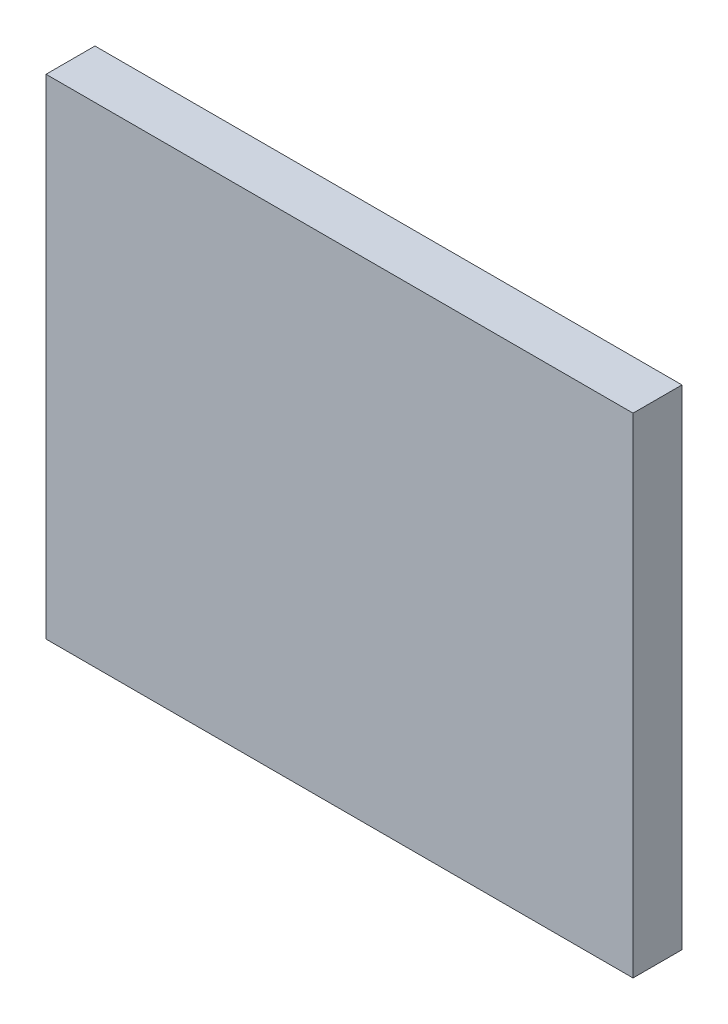
ISO-10303-21;
HEADER;
FILE_DESCRIPTION(('STEP AP214'),'2;1');
FILE_NAME('part.step','',(''),(''),'','','');
FILE_SCHEMA(('AUTOMOTIVE_DESIGN { 1 0 10303 214 1 1 1 1 }'));
ENDSEC;
DATA;
#1=APPLICATION_CONTEXT('core data for automotive mechanical design processes');
#2=APPLICATION_PROTOCOL_DEFINITION('international standard','automotive_design',2000,#1);
#3=PRODUCT_CONTEXT('',#1,'mechanical');
#4=PRODUCT('Part','Part','',(#3));
#5=PRODUCT_RELATED_PRODUCT_CATEGORY('part','',(#4));
#6=PRODUCT_DEFINITION_FORMATION('','',#4);
#7=PRODUCT_DEFINITION_CONTEXT('part definition',#1,'design');
#8=PRODUCT_DEFINITION('design','',#6,#7);
#9=PRODUCT_DEFINITION_SHAPE('','',#8);
#10=(LENGTH_UNIT() NAMED_UNIT(*) SI_UNIT(.MILLI.,.METRE.));
#11=(NAMED_UNIT(*) PLANE_ANGLE_UNIT() SI_UNIT($,.RADIAN.));
#12=(NAMED_UNIT(*) SI_UNIT($,.STERADIAN.) SOLID_ANGLE_UNIT());
#13=UNCERTAINTY_MEASURE_WITH_UNIT(LENGTH_MEASURE(1.E-05),#10,'distance_accuracy_value','');
#14=(GEOMETRIC_REPRESENTATION_CONTEXT(3) GLOBAL_UNCERTAINTY_ASSIGNED_CONTEXT((#13)) GLOBAL_UNIT_ASSIGNED_CONTEXT((#10,
#11,#12)) REPRESENTATION_CONTEXT('',''));
#15=CARTESIAN_POINT('',(0.,0.,0.));
#16=DIRECTION('',(0.,0.,1.));
#17=DIRECTION('',(1.,0.,0.));
#18=AXIS2_PLACEMENT_3D('',#15,#16,#17);
#19=CARTESIAN_POINT('',(-30.,25.,5.));
#20=DIRECTION('',(1.,0.,0.));
#21=DIRECTION('',(0.,1.,0.));
#22=AXIS2_PLACEMENT_3D('',#19,#20,#21);
#23=PLANE('',#22);
#24=DIRECTION('',(0.,-1.,0.));
#25=VECTOR('',#24,1.);
#26=CARTESIAN_POINT('',(-30.,25.,0.));
#27=LINE('',#26,#25);
#28=CARTESIAN_POINT('',(-30.,25.,0.));
#29=VERTEX_POINT('',#28);
#30=CARTESIAN_POINT('',(-30.,-25.,0.));
#31=VERTEX_POINT('',#30);
#32=EDGE_CURVE('E96',#29,#31,#27,.T.);
#33=ORIENTED_EDGE('',*,*,#32,.T.);
#34=DIRECTION('',(0.,0.,-1.));
#35=VECTOR('',#34,1.);
#36=CARTESIAN_POINT('',(-30.,-25.,5.));
#37=LINE('',#36,#35);
#38=CARTESIAN_POINT('',(-30.,-25.,5.));
#39=VERTEX_POINT('',#38);
#40=EDGE_CURVE('E11',#39,#31,#37,.T.);
#41=ORIENTED_EDGE('',*,*,#40,.F.);
#42=DIRECTION('',(0.,-1.,0.));
#43=VECTOR('',#42,1.);
#44=CARTESIAN_POINT('',(-30.,25.,5.));
#45=LINE('',#44,#43);
#46=CARTESIAN_POINT('',(-30.,25.,5.));
#47=VERTEX_POINT('',#46);
#48=EDGE_CURVE('E84',#47,#39,#45,.T.);
#49=ORIENTED_EDGE('',*,*,#48,.F.);
#50=DIRECTION('',(0.,0.,-1.));
#51=VECTOR('',#50,1.);
#52=CARTESIAN_POINT('',(-30.,25.,5.));
#53=LINE('',#52,#51);
#54=EDGE_CURVE('E92',#47,#29,#53,.T.);
#55=ORIENTED_EDGE('',*,*,#54,.T.);
#56=EDGE_LOOP('',(#33,#41,#49,#55));
#57=FACE_BOUND('',#56,.T.);
#58=ADVANCED_FACE('F33',(#57),#23,.F.);
#59=CARTESIAN_POINT('',(-30.,-25.,5.));
#60=DIRECTION('',(0.,1.,0.));
#61=DIRECTION('',(0.,0.,1.));
#62=AXIS2_PLACEMENT_3D('',#59,#60,#61);
#63=PLANE('',#62);
#64=DIRECTION('',(1.,0.,0.));
#65=VECTOR('',#64,1.);
#66=CARTESIAN_POINT('',(-30.,-25.,0.));
#67=LINE('',#66,#65);
#68=CARTESIAN_POINT('',(30.,-25.,0.));
#69=VERTEX_POINT('',#68);
#70=EDGE_CURVE('E88',#31,#69,#67,.T.);
#71=ORIENTED_EDGE('',*,*,#70,.T.);
#72=DIRECTION('',(0.,0.,-1.));
#73=VECTOR('',#72,1.);
#74=CARTESIAN_POINT('',(30.,-25.,5.));
#75=LINE('',#74,#73);
#76=CARTESIAN_POINT('',(30.,-25.,5.));
#77=VERTEX_POINT('',#76);
#78=EDGE_CURVE('E41',#77,#69,#75,.T.);
#79=ORIENTED_EDGE('',*,*,#78,.F.);
#80=DIRECTION('',(1.,0.,0.));
#81=VECTOR('',#80,1.);
#82=CARTESIAN_POINT('',(-30.,-25.,5.));
#83=LINE('',#82,#81);
#84=EDGE_CURVE('E79',#39,#77,#83,.T.);
#85=ORIENTED_EDGE('',*,*,#84,.F.);
#86=ORIENTED_EDGE('',*,*,#40,.T.);
#87=EDGE_LOOP('',(#71,#79,#85,#86));
#88=FACE_BOUND('',#87,.T.);
#89=ADVANCED_FACE('F87',(#88),#63,.F.);
#90=CARTESIAN_POINT('',(30.,25.,5.));
#91=DIRECTION('',(-1.,0.,0.));
#92=DIRECTION('',(0.,-1.,0.));
#93=AXIS2_PLACEMENT_3D('',#90,#91,#92);
#94=PLANE('',#93);
#95=DIRECTION('',(0.,1.,0.));
#96=VECTOR('',#95,1.);
#97=CARTESIAN_POINT('',(30.,25.,0.));
#98=LINE('',#97,#96);
#99=CARTESIAN_POINT('',(30.,25.,0.));
#100=VERTEX_POINT('',#99);
#101=EDGE_CURVE('E66',#69,#100,#98,.T.);
#102=ORIENTED_EDGE('',*,*,#101,.T.);
#103=DIRECTION('',(0.,0.,-1.));
#104=VECTOR('',#103,1.);
#105=CARTESIAN_POINT('',(30.,25.,5.));
#106=LINE('',#105,#104);
#107=CARTESIAN_POINT('',(30.,25.,5.));
#108=VERTEX_POINT('',#107);
#109=EDGE_CURVE('E89',#108,#100,#106,.T.);
#110=ORIENTED_EDGE('',*,*,#109,.F.);
#111=DIRECTION('',(0.,1.,0.));
#112=VECTOR('',#111,1.);
#113=CARTESIAN_POINT('',(30.,25.,5.));
#114=LINE('',#113,#112);
#115=EDGE_CURVE('E82',#77,#108,#114,.T.);
#116=ORIENTED_EDGE('',*,*,#115,.F.);
#117=ORIENTED_EDGE('',*,*,#78,.T.);
#118=EDGE_LOOP('',(#102,#110,#116,#117));
#119=FACE_BOUND('',#118,.T.);
#120=ADVANCED_FACE('F90',(#119),#94,.F.);
#121=CARTESIAN_POINT('',(-30.,25.,5.));
#122=DIRECTION('',(0.,-1.,0.));
#123=DIRECTION('',(0.,0.,-1.));
#124=AXIS2_PLACEMENT_3D('',#121,#122,#123);
#125=PLANE('',#124);
#126=DIRECTION('',(-1.,0.,0.));
#127=VECTOR('',#126,1.);
#128=CARTESIAN_POINT('',(-30.,25.,0.));
#129=LINE('',#128,#127);
#130=EDGE_CURVE('E72',#100,#29,#129,.T.);
#131=ORIENTED_EDGE('',*,*,#130,.T.);
#132=ORIENTED_EDGE('',*,*,#54,.F.);
#133=DIRECTION('',(-1.,0.,0.));
#134=VECTOR('',#133,1.);
#135=CARTESIAN_POINT('',(-30.,25.,5.));
#136=LINE('',#135,#134);
#137=EDGE_CURVE('E49',#108,#47,#136,.T.);
#138=ORIENTED_EDGE('',*,*,#137,.F.);
#139=ORIENTED_EDGE('',*,*,#109,.T.);
#140=EDGE_LOOP('',(#131,#132,#138,#139));
#141=FACE_BOUND('',#140,.T.);
#142=ADVANCED_FACE('F103',(#141),#125,.F.);
#143=CARTESIAN_POINT('',(0.,0.,5.));
#144=DIRECTION('',(0.,0.,1.));
#145=DIRECTION('',(1.,0.,0.));
#146=AXIS2_PLACEMENT_3D('',#143,#144,#145);
#147=PLANE('',#146);
#148=ORIENTED_EDGE('',*,*,#48,.T.);
#149=ORIENTED_EDGE('',*,*,#84,.T.);
#150=ORIENTED_EDGE('',*,*,#115,.T.);
#151=ORIENTED_EDGE('',*,*,#137,.T.);
#152=EDGE_LOOP('',(#148,#149,#150,#151));
#153=FACE_BOUND('',#152,.T.);
#154=ADVANCED_FACE('F80',(#153),#147,.T.);
#155=CARTESIAN_POINT('',(0.,0.,0.));
#156=DIRECTION('',(0.,0.,1.));
#157=DIRECTION('',(1.,0.,0.));
#158=AXIS2_PLACEMENT_3D('',#155,#156,#157);
#159=PLANE('',#158);
#160=ORIENTED_EDGE('',*,*,#32,.F.);
#161=ORIENTED_EDGE('',*,*,#130,.F.);
#162=ORIENTED_EDGE('',*,*,#101,.F.);
#163=ORIENTED_EDGE('',*,*,#70,.F.);
#164=EDGE_LOOP('',(#160,#161,#162,#163));
#165=FACE_BOUND('',#164,.T.);
#166=ADVANCED_FACE('F106',(#165),#159,.F.);
#167=CLOSED_SHELL('',(#58,#89,#120,#142,#154,#166));
#168=MANIFOLD_SOLID_BREP('B2',#167);
#169=ADVANCED_BREP_SHAPE_REPRESENTATION('',(#18,#168),#14);
#170=SHAPE_DEFINITION_REPRESENTATION(#9,#169);
ENDSEC;
END-ISO-10303-21;
